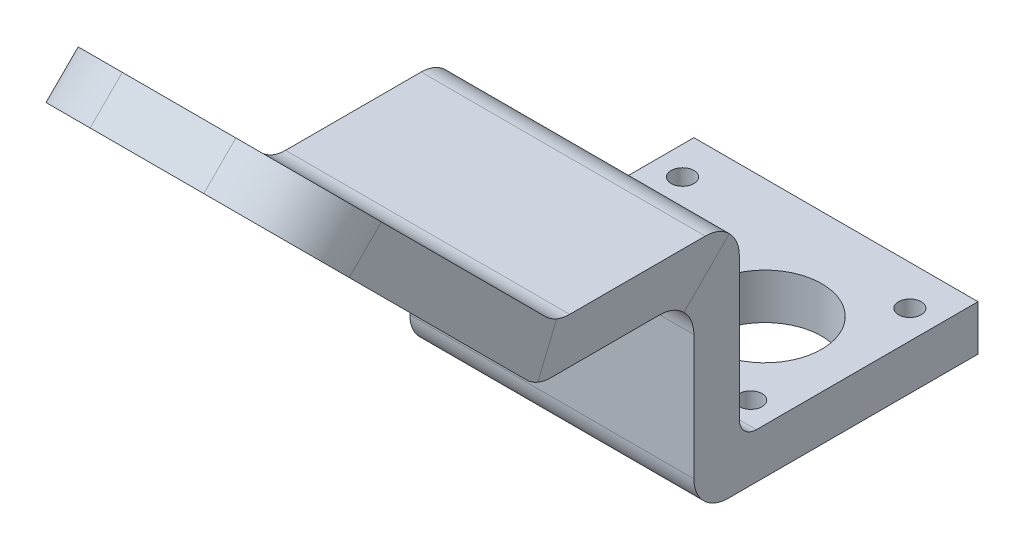
ISO-10303-21;
HEADER;
FILE_DESCRIPTION(('STEP AP214'),'2;1');
FILE_NAME('part.step','',(''),(''),'','','');
FILE_SCHEMA(('AUTOMOTIVE_DESIGN { 1 0 10303 214 1 1 1 1 }'));
ENDSEC;
DATA;
#1=APPLICATION_CONTEXT('core data for automotive mechanical design processes');
#2=APPLICATION_PROTOCOL_DEFINITION('international standard','automotive_design',2000,#1);
#3=PRODUCT_CONTEXT('',#1,'mechanical');
#4=PRODUCT('Part','Part','',(#3));
#5=PRODUCT_RELATED_PRODUCT_CATEGORY('part','',(#4));
#6=PRODUCT_DEFINITION_FORMATION('','',#4);
#7=PRODUCT_DEFINITION_CONTEXT('part definition',#1,'design');
#8=PRODUCT_DEFINITION('design','',#6,#7);
#9=PRODUCT_DEFINITION_SHAPE('','',#8);
#10=(LENGTH_UNIT() NAMED_UNIT(*) SI_UNIT(.MILLI.,.METRE.));
#11=(NAMED_UNIT(*) PLANE_ANGLE_UNIT() SI_UNIT($,.RADIAN.));
#12=(NAMED_UNIT(*) SI_UNIT($,.STERADIAN.) SOLID_ANGLE_UNIT());
#13=UNCERTAINTY_MEASURE_WITH_UNIT(LENGTH_MEASURE(1.E-05),#10,'distance_accuracy_value','');
#14=(GEOMETRIC_REPRESENTATION_CONTEXT(3) GLOBAL_UNCERTAINTY_ASSIGNED_CONTEXT((#13)) GLOBAL_UNIT_ASSIGNED_CONTEXT((#10,
#11,#12)) REPRESENTATION_CONTEXT('',''));
#15=CARTESIAN_POINT('',(0.,0.,0.));
#16=DIRECTION('',(0.,0.,1.));
#17=DIRECTION('',(1.,0.,0.));
#18=AXIS2_PLACEMENT_3D('',#15,#16,#17);
#19=CARTESIAN_POINT('',(25.,8.,-21.));
#20=DIRECTION('',(-1.,0.,0.));
#21=DIRECTION('',(0.,0.,1.));
#22=AXIS2_PLACEMENT_3D('',#19,#20,#21);
#23=PLANE('',#22);
#24=DIRECTION('',(0.,-1.,0.));
#25=VECTOR('',#24,1.);
#26=CARTESIAN_POINT('',(25.,33.,29.));
#27=LINE('',#26,#25);
#28=CARTESIAN_POINT('',(25.,28.,29.));
#29=VERTEX_POINT('',#28);
#30=CARTESIAN_POINT('',(25.,6.,29.));
#31=VERTEX_POINT('',#30);
#32=EDGE_CURVE('E349',#29,#31,#27,.T.);
#33=ORIENTED_EDGE('',*,*,#32,.T.);
#34=CARTESIAN_POINT('',(25.,6.,23.));
#35=DIRECTION('',(-1.,0.,0.));
#36=DIRECTION('',(0.,0.,1.));
#37=AXIS2_PLACEMENT_3D('',#34,#35,#36);
#38=CIRCLE('',#37,6.);
#39=CARTESIAN_POINT('',(25.,0.,23.));
#40=VERTEX_POINT('',#39);
#41=EDGE_CURVE('E244',#31,#40,#38,.F.);
#42=ORIENTED_EDGE('',*,*,#41,.T.);
#43=DIRECTION('',(0.,0.,-1.));
#44=VECTOR('',#43,1.);
#45=CARTESIAN_POINT('',(25.,0.,-21.));
#46=LINE('',#45,#44);
#47=CARTESIAN_POINT('',(25.,0.,-21.));
#48=VERTEX_POINT('',#47);
#49=EDGE_CURVE('E208',#40,#48,#46,.T.);
#50=ORIENTED_EDGE('',*,*,#49,.T.);
#51=DIRECTION('',(0.,-1.,0.));
#52=VECTOR('',#51,1.);
#53=CARTESIAN_POINT('',(25.,8.,-21.));
#54=LINE('',#53,#52);
#55=CARTESIAN_POINT('',(25.,8.,-21.));
#56=VERTEX_POINT('',#55);
#57=EDGE_CURVE('E200',#56,#48,#54,.T.);
#58=ORIENTED_EDGE('',*,*,#57,.F.);
#59=DIRECTION('',(0.,0.,-1.));
#60=VECTOR('',#59,1.);
#61=CARTESIAN_POINT('',(25.,8.,-21.));
#62=LINE('',#61,#60);
#63=CARTESIAN_POINT('',(25.,8.,18.));
#64=VERTEX_POINT('',#63);
#65=EDGE_CURVE('E185',#64,#56,#62,.T.);
#66=ORIENTED_EDGE('',*,*,#65,.F.);
#67=CARTESIAN_POINT('',(25.,11.,18.));
#68=DIRECTION('',(-1.,0.,0.));
#69=DIRECTION('',(0.,0.,1.));
#70=AXIS2_PLACEMENT_3D('',#67,#68,#69);
#71=CIRCLE('',#70,3.);
#72=CARTESIAN_POINT('',(25.,11.,21.));
#73=VERTEX_POINT('',#72);
#74=EDGE_CURVE('E298',#64,#73,#71,.T.);
#75=ORIENTED_EDGE('',*,*,#74,.T.);
#76=DIRECTION('',(0.,-1.,0.));
#77=VECTOR('',#76,1.);
#78=CARTESIAN_POINT('',(25.,33.,21.));
#79=LINE('',#78,#77);
#80=CARTESIAN_POINT('',(25.,36.,21.));
#81=VERTEX_POINT('',#80);
#82=EDGE_CURVE('E351',#81,#73,#79,.T.);
#83=ORIENTED_EDGE('',*,*,#82,.F.);
#84=CARTESIAN_POINT('',(25.,36.,27.));
#85=DIRECTION('',(-1.,0.,0.));
#86=DIRECTION('',(0.,0.,1.));
#87=AXIS2_PLACEMENT_3D('',#84,#85,#86);
#88=CIRCLE('',#87,6.);
#89=CARTESIAN_POINT('',(25.,40.2426406871193,22.7573593128807));
#90=VERTEX_POINT('',#89);
#91=EDGE_CURVE('E242',#81,#90,#88,.F.);
#92=ORIENTED_EDGE('',*,*,#91,.T.);
#93=DIRECTION('',(0.,-0.707106781186547,0.707106781186548));
#94=VECTOR('',#93,1.);
#95=CARTESIAN_POINT('',(25.,33.5,29.5));
#96=LINE('',#95,#94);
#97=CARTESIAN_POINT('',(25.,32.2426406871193,30.7573593128807));
#98=VERTEX_POINT('',#97);
#99=EDGE_CURVE('E392',#90,#98,#96,.T.);
#100=ORIENTED_EDGE('',*,*,#99,.T.);
#101=CARTESIAN_POINT('',(25.,28.,35.));
#102=DIRECTION('',(-1.,0.,0.));
#103=DIRECTION('',(0.,0.,1.));
#104=AXIS2_PLACEMENT_3D('',#101,#102,#103);
#105=CIRCLE('',#104,6.);
#106=EDGE_CURVE('E293',#98,#29,#105,.T.);
#107=ORIENTED_EDGE('',*,*,#106,.T.);
#108=EDGE_LOOP('',(#33,#42,#50,#58,#66,#75,#83,#92,#100,#107));
#109=FACE_BOUND('',#108,.T.);
#110=ADVANCED_FACE('F34',(#109),#23,.F.);
#111=CARTESIAN_POINT('',(-25.,8.,-21.));
#112=DIRECTION('',(0.,0.,1.));
#113=DIRECTION('',(1.,0.,0.));
#114=AXIS2_PLACEMENT_3D('',#111,#112,#113);
#115=PLANE('',#114);
#116=DIRECTION('',(-1.,0.,0.));
#117=VECTOR('',#116,1.);
#118=CARTESIAN_POINT('',(-25.,0.,-21.));
#119=LINE('',#118,#117);
#120=CARTESIAN_POINT('',(-25.,0.,-21.));
#121=VERTEX_POINT('',#120);
#122=EDGE_CURVE('E373',#48,#121,#119,.T.);
#123=ORIENTED_EDGE('',*,*,#122,.T.);
#124=DIRECTION('',(0.,-1.,0.));
#125=VECTOR('',#124,1.);
#126=CARTESIAN_POINT('',(-25.,8.,-21.));
#127=LINE('',#126,#125);
#128=CARTESIAN_POINT('',(-25.,8.,-21.));
#129=VERTEX_POINT('',#128);
#130=EDGE_CURVE('E202',#129,#121,#127,.T.);
#131=ORIENTED_EDGE('',*,*,#130,.F.);
#132=DIRECTION('',(-1.,0.,0.));
#133=VECTOR('',#132,1.);
#134=CARTESIAN_POINT('',(-25.,8.,-21.));
#135=LINE('',#134,#133);
#136=EDGE_CURVE('E189',#56,#129,#135,.T.);
#137=ORIENTED_EDGE('',*,*,#136,.F.);
#138=ORIENTED_EDGE('',*,*,#57,.T.);
#139=EDGE_LOOP('',(#123,#131,#137,#138));
#140=FACE_BOUND('',#139,.T.);
#141=ADVANCED_FACE('F199',(#140),#115,.F.);
#142=CARTESIAN_POINT('',(-25.,8.,-21.));
#143=DIRECTION('',(1.,0.,0.));
#144=DIRECTION('',(0.,0.,-1.));
#145=AXIS2_PLACEMENT_3D('',#142,#143,#144);
#146=PLANE('',#145);
#147=DIRECTION('',(0.,0.,1.));
#148=VECTOR('',#147,1.);
#149=CARTESIAN_POINT('',(-25.,0.,-21.));
#150=LINE('',#149,#148);
#151=CARTESIAN_POINT('',(-25.,0.,23.));
#152=VERTEX_POINT('',#151);
#153=EDGE_CURVE('E195',#121,#152,#150,.T.);
#154=ORIENTED_EDGE('',*,*,#153,.T.);
#155=CARTESIAN_POINT('',(-25.,6.,23.));
#156=DIRECTION('',(1.,0.,0.));
#157=DIRECTION('',(0.,0.,-1.));
#158=AXIS2_PLACEMENT_3D('',#155,#156,#157);
#159=CIRCLE('',#158,6.);
#160=CARTESIAN_POINT('',(-25.,6.,29.));
#161=VERTEX_POINT('',#160);
#162=EDGE_CURVE('E235',#152,#161,#159,.F.);
#163=ORIENTED_EDGE('',*,*,#162,.T.);
#164=DIRECTION('',(0.,-1.,0.));
#165=VECTOR('',#164,1.);
#166=CARTESIAN_POINT('',(-25.,33.,29.));
#167=LINE('',#166,#165);
#168=CARTESIAN_POINT('',(-25.,28.,29.));
#169=VERTEX_POINT('',#168);
#170=EDGE_CURVE('E345',#169,#161,#167,.T.);
#171=ORIENTED_EDGE('',*,*,#170,.F.);
#172=CARTESIAN_POINT('',(-25.,28.,35.));
#173=DIRECTION('',(1.,0.,0.));
#174=DIRECTION('',(0.,0.,-1.));
#175=AXIS2_PLACEMENT_3D('',#172,#173,#174);
#176=CIRCLE('',#175,6.);
#177=CARTESIAN_POINT('',(-25.,32.2426406871193,30.7573593128807));
#178=VERTEX_POINT('',#177);
#179=EDGE_CURVE('E285',#169,#178,#176,.T.);
#180=ORIENTED_EDGE('',*,*,#179,.T.);
#181=DIRECTION('',(0.,0.707106781186547,-0.707106781186548));
#182=VECTOR('',#181,1.);
#183=CARTESIAN_POINT('',(-25.,37.5,25.5));
#184=LINE('',#183,#182);
#185=CARTESIAN_POINT('',(-25.,40.2426406871193,22.7573593128807));
#186=VERTEX_POINT('',#185);
#187=EDGE_CURVE('E357',#178,#186,#184,.T.);
#188=ORIENTED_EDGE('',*,*,#187,.T.);
#189=CARTESIAN_POINT('',(-25.,36.,27.));
#190=DIRECTION('',(1.,0.,0.));
#191=DIRECTION('',(0.,0.,-1.));
#192=AXIS2_PLACEMENT_3D('',#189,#190,#191);
#193=CIRCLE('',#192,6.);
#194=CARTESIAN_POINT('',(-25.,36.,21.));
#195=VERTEX_POINT('',#194);
#196=EDGE_CURVE('E213',#186,#195,#193,.F.);
#197=ORIENTED_EDGE('',*,*,#196,.T.);
#198=DIRECTION('',(0.,-1.,0.));
#199=VECTOR('',#198,1.);
#200=CARTESIAN_POINT('',(-25.,33.,21.));
#201=LINE('',#200,#199);
#202=CARTESIAN_POINT('',(-25.,11.,21.));
#203=VERTEX_POINT('',#202);
#204=EDGE_CURVE('E354',#195,#203,#201,.T.);
#205=ORIENTED_EDGE('',*,*,#204,.T.);
#206=CARTESIAN_POINT('',(-25.,11.,18.));
#207=DIRECTION('',(1.,0.,0.));
#208=DIRECTION('',(0.,0.,-1.));
#209=AXIS2_PLACEMENT_3D('',#206,#207,#208);
#210=CIRCLE('',#209,3.);
#211=CARTESIAN_POINT('',(-25.,8.,18.));
#212=VERTEX_POINT('',#211);
#213=EDGE_CURVE('E300',#203,#212,#210,.T.);
#214=ORIENTED_EDGE('',*,*,#213,.T.);
#215=DIRECTION('',(0.,0.,1.));
#216=VECTOR('',#215,1.);
#217=CARTESIAN_POINT('',(-25.,8.,-21.));
#218=LINE('',#217,#216);
#219=EDGE_CURVE('E204',#129,#212,#218,.T.);
#220=ORIENTED_EDGE('',*,*,#219,.F.);
#221=ORIENTED_EDGE('',*,*,#130,.T.);
#222=EDGE_LOOP('',(#154,#163,#171,#180,#188,#197,#205,#214,#220,#221));
#223=FACE_BOUND('',#222,.T.);
#224=ADVANCED_FACE('F377',(#223),#146,.F.);
#225=CARTESIAN_POINT('',(0.,8.,0.));
#226=DIRECTION('',(0.,1.,0.));
#227=DIRECTION('',(0.,0.,1.));
#228=AXIS2_PLACEMENT_3D('',#225,#226,#227);
#229=PLANE('',#228);
#230=CARTESIAN_POINT('',(20.,8.,-14.));
#231=DIRECTION('',(0.,1.,0.));
#232=DIRECTION('',(0.,0.,1.));
#233=AXIS2_PLACEMENT_3D('',#230,#231,#232);
#234=CIRCLE('',#233,2.);
#235=CARTESIAN_POINT('',(20.,8.,-12.));
#236=VERTEX_POINT('',#235);
#237=EDGE_CURVE('E364',#236,#236,#234,.T.);
#238=ORIENTED_EDGE('',*,*,#237,.F.);
#239=EDGE_LOOP('',(#238));
#240=FACE_BOUND('',#239,.T.);
#241=CARTESIAN_POINT('',(20.,8.,14.));
#242=DIRECTION('',(0.,1.,0.));
#243=DIRECTION('',(0.,0.,1.));
#244=AXIS2_PLACEMENT_3D('',#241,#242,#243);
#245=CIRCLE('',#244,2.);
#246=CARTESIAN_POINT('',(20.,8.,16.));
#247=VERTEX_POINT('',#246);
#248=EDGE_CURVE('E361',#247,#247,#245,.T.);
#249=ORIENTED_EDGE('',*,*,#248,.F.);
#250=EDGE_LOOP('',(#249));
#251=FACE_BOUND('',#250,.T.);
#252=CARTESIAN_POINT('',(-20.,8.,14.));
#253=DIRECTION('',(0.,1.,0.));
#254=DIRECTION('',(0.,0.,1.));
#255=AXIS2_PLACEMENT_3D('',#252,#253,#254);
#256=CIRCLE('',#255,2.);
#257=CARTESIAN_POINT('',(-20.,8.,16.));
#258=VERTEX_POINT('',#257);
#259=EDGE_CURVE('E358',#258,#258,#256,.T.);
#260=ORIENTED_EDGE('',*,*,#259,.F.);
#261=EDGE_LOOP('',(#260));
#262=FACE_BOUND('',#261,.T.);
#263=CARTESIAN_POINT('',(8.50000000000001,8.,0.));
#264=DIRECTION('',(0.,1.,0.));
#265=DIRECTION('',(0.,0.,1.));
#266=AXIS2_PLACEMENT_3D('',#263,#264,#265);
#267=CIRCLE('',#266,10.);
#268=CARTESIAN_POINT('',(8.50000000000001,8.,10.));
#269=VERTEX_POINT('',#268);
#270=EDGE_CURVE('E348',#269,#269,#267,.T.);
#271=ORIENTED_EDGE('',*,*,#270,.F.);
#272=EDGE_LOOP('',(#271));
#273=FACE_BOUND('',#272,.T.);
#274=CARTESIAN_POINT('',(-20.,8.,-14.));
#275=DIRECTION('',(0.,1.,0.));
#276=DIRECTION('',(0.,0.,1.));
#277=AXIS2_PLACEMENT_3D('',#274,#275,#276);
#278=CIRCLE('',#277,2.);
#279=CARTESIAN_POINT('',(-20.,8.,-12.));
#280=VERTEX_POINT('',#279);
#281=EDGE_CURVE('E222',#280,#280,#278,.T.);
#282=ORIENTED_EDGE('',*,*,#281,.F.);
#283=EDGE_LOOP('',(#282));
#284=FACE_BOUND('',#283,.T.);
#285=ORIENTED_EDGE('',*,*,#219,.T.);
#286=DIRECTION('',(1.,0.,0.));
#287=VECTOR('',#286,1.);
#288=CARTESIAN_POINT('',(25.,8.,18.));
#289=LINE('',#288,#287);
#290=EDGE_CURVE('E192',#212,#64,#289,.T.);
#291=ORIENTED_EDGE('',*,*,#290,.T.);
#292=ORIENTED_EDGE('',*,*,#65,.T.);
#293=ORIENTED_EDGE('',*,*,#136,.T.);
#294=EDGE_LOOP('',(#285,#291,#292,#293));
#295=FACE_BOUND('',#294,.T.);
#296=ADVANCED_FACE('F188',(#240,#251,#262,#273,#284,#295),#229,.T.);
#297=CARTESIAN_POINT('',(0.,0.,0.));
#298=DIRECTION('',(0.,1.,0.));
#299=DIRECTION('',(0.,0.,1.));
#300=AXIS2_PLACEMENT_3D('',#297,#298,#299);
#301=PLANE('',#300);
#302=CARTESIAN_POINT('',(20.,0.,-14.));
#303=DIRECTION('',(0.,1.,0.));
#304=DIRECTION('',(0.,0.,1.));
#305=AXIS2_PLACEMENT_3D('',#302,#303,#304);
#306=CIRCLE('',#305,2.);
#307=CARTESIAN_POINT('',(20.,0.,-12.));
#308=VERTEX_POINT('',#307);
#309=EDGE_CURVE('E231',#308,#308,#306,.T.);
#310=ORIENTED_EDGE('',*,*,#309,.T.);
#311=EDGE_LOOP('',(#310));
#312=FACE_BOUND('',#311,.T.);
#313=CARTESIAN_POINT('',(20.,0.,14.));
#314=DIRECTION('',(0.,1.,0.));
#315=DIRECTION('',(0.,0.,1.));
#316=AXIS2_PLACEMENT_3D('',#313,#314,#315);
#317=CIRCLE('',#316,2.);
#318=CARTESIAN_POINT('',(20.,0.,16.));
#319=VERTEX_POINT('',#318);
#320=EDGE_CURVE('E228',#319,#319,#317,.T.);
#321=ORIENTED_EDGE('',*,*,#320,.T.);
#322=EDGE_LOOP('',(#321));
#323=FACE_BOUND('',#322,.T.);
#324=CARTESIAN_POINT('',(-20.,0.,14.));
#325=DIRECTION('',(0.,1.,0.));
#326=DIRECTION('',(0.,0.,1.));
#327=AXIS2_PLACEMENT_3D('',#324,#325,#326);
#328=CIRCLE('',#327,2.);
#329=CARTESIAN_POINT('',(-20.,0.,16.));
#330=VERTEX_POINT('',#329);
#331=EDGE_CURVE('E225',#330,#330,#328,.T.);
#332=ORIENTED_EDGE('',*,*,#331,.T.);
#333=EDGE_LOOP('',(#332));
#334=FACE_BOUND('',#333,.T.);
#335=CARTESIAN_POINT('',(8.50000000000001,0.,0.));
#336=DIRECTION('',(0.,1.,0.));
#337=DIRECTION('',(0.,0.,1.));
#338=AXIS2_PLACEMENT_3D('',#335,#336,#337);
#339=CIRCLE('',#338,10.);
#340=CARTESIAN_POINT('',(8.50000000000001,0.,10.));
#341=VERTEX_POINT('',#340);
#342=EDGE_CURVE('E221',#341,#341,#339,.T.);
#343=ORIENTED_EDGE('',*,*,#342,.T.);
#344=EDGE_LOOP('',(#343));
#345=FACE_BOUND('',#344,.T.);
#346=CARTESIAN_POINT('',(-20.,0.,-14.));
#347=DIRECTION('',(0.,1.,0.));
#348=DIRECTION('',(0.,0.,1.));
#349=AXIS2_PLACEMENT_3D('',#346,#347,#348);
#350=CIRCLE('',#349,2.);
#351=CARTESIAN_POINT('',(-20.,0.,-12.));
#352=VERTEX_POINT('',#351);
#353=EDGE_CURVE('E218',#352,#352,#350,.T.);
#354=ORIENTED_EDGE('',*,*,#353,.T.);
#355=EDGE_LOOP('',(#354));
#356=FACE_BOUND('',#355,.T.);
#357=ORIENTED_EDGE('',*,*,#49,.F.);
#358=DIRECTION('',(-1.,0.,0.));
#359=VECTOR('',#358,1.);
#360=CARTESIAN_POINT('',(-25.,0.,23.));
#361=LINE('',#360,#359);
#362=EDGE_CURVE('E210',#40,#152,#361,.T.);
#363=ORIENTED_EDGE('',*,*,#362,.T.);
#364=ORIENTED_EDGE('',*,*,#153,.F.);
#365=ORIENTED_EDGE('',*,*,#122,.F.);
#366=EDGE_LOOP('',(#357,#363,#364,#365));
#367=FACE_BOUND('',#366,.T.);
#368=ADVANCED_FACE('F380',(#312,#323,#334,#345,#356,#367),#301,.F.);
#369=CARTESIAN_POINT('',(-20.,-4.,-14.));
#370=DIRECTION('',(0.,1.,0.));
#371=DIRECTION('',(0.,0.,1.));
#372=AXIS2_PLACEMENT_3D('',#369,#370,#371);
#373=CYLINDRICAL_SURFACE('',#372,2.);
#374=ORIENTED_EDGE('',*,*,#281,.T.);
#375=EDGE_LOOP('',(#374));
#376=FACE_BOUND('',#375,.T.);
#377=ORIENTED_EDGE('',*,*,#353,.F.);
#378=EDGE_LOOP('',(#377));
#379=FACE_BOUND('',#378,.T.);
#380=ADVANCED_FACE('F686',(#376,#379),#373,.F.);
#381=CARTESIAN_POINT('',(8.50000000000001,-4.,0.));
#382=DIRECTION('',(0.,1.,0.));
#383=DIRECTION('',(0.,0.,1.));
#384=AXIS2_PLACEMENT_3D('',#381,#382,#383);
#385=CYLINDRICAL_SURFACE('',#384,10.);
#386=ORIENTED_EDGE('',*,*,#270,.T.);
#387=EDGE_LOOP('',(#386));
#388=FACE_BOUND('',#387,.T.);
#389=ORIENTED_EDGE('',*,*,#342,.F.);
#390=EDGE_LOOP('',(#389));
#391=FACE_BOUND('',#390,.T.);
#392=ADVANCED_FACE('F682',(#388,#391),#385,.F.);
#393=CARTESIAN_POINT('',(-20.,-4.,14.));
#394=DIRECTION('',(0.,1.,0.));
#395=DIRECTION('',(0.,0.,1.));
#396=AXIS2_PLACEMENT_3D('',#393,#394,#395);
#397=CYLINDRICAL_SURFACE('',#396,2.);
#398=ORIENTED_EDGE('',*,*,#259,.T.);
#399=EDGE_LOOP('',(#398));
#400=FACE_BOUND('',#399,.T.);
#401=ORIENTED_EDGE('',*,*,#331,.F.);
#402=EDGE_LOOP('',(#401));
#403=FACE_BOUND('',#402,.T.);
#404=ADVANCED_FACE('F678',(#400,#403),#397,.F.);
#405=CARTESIAN_POINT('',(20.,-4.,14.));
#406=DIRECTION('',(0.,1.,0.));
#407=DIRECTION('',(0.,0.,1.));
#408=AXIS2_PLACEMENT_3D('',#405,#406,#407);
#409=CYLINDRICAL_SURFACE('',#408,2.);
#410=ORIENTED_EDGE('',*,*,#248,.T.);
#411=EDGE_LOOP('',(#410));
#412=FACE_BOUND('',#411,.T.);
#413=ORIENTED_EDGE('',*,*,#320,.F.);
#414=EDGE_LOOP('',(#413));
#415=FACE_BOUND('',#414,.T.);
#416=ADVANCED_FACE('F681',(#412,#415),#409,.F.);
#417=CARTESIAN_POINT('',(20.,-4.,-14.));
#418=DIRECTION('',(0.,1.,0.));
#419=DIRECTION('',(0.,0.,1.));
#420=AXIS2_PLACEMENT_3D('',#417,#418,#419);
#421=CYLINDRICAL_SURFACE('',#420,2.);
#422=ORIENTED_EDGE('',*,*,#237,.T.);
#423=EDGE_LOOP('',(#422));
#424=FACE_BOUND('',#423,.T.);
#425=ORIENTED_EDGE('',*,*,#309,.F.);
#426=EDGE_LOOP('',(#425));
#427=FACE_BOUND('',#426,.T.);
#428=ADVANCED_FACE('F537',(#424,#427),#421,.F.);
#429=CARTESIAN_POINT('',(-25.,33.,21.));
#430=DIRECTION('',(0.,0.,-1.));
#431=DIRECTION('',(-1.,0.,0.));
#432=AXIS2_PLACEMENT_3D('',#429,#430,#431);
#433=PLANE('',#432);
#434=ORIENTED_EDGE('',*,*,#82,.T.);
#435=DIRECTION('',(1.,0.,0.));
#436=VECTOR('',#435,1.);
#437=CARTESIAN_POINT('',(-25.,11.,21.));
#438=LINE('',#437,#436);
#439=EDGE_CURVE('E296',#73,#203,#438,.F.);
#440=ORIENTED_EDGE('',*,*,#439,.T.);
#441=ORIENTED_EDGE('',*,*,#204,.F.);
#442=DIRECTION('',(1.,0.,0.));
#443=VECTOR('',#442,1.);
#444=CARTESIAN_POINT('',(-25.,36.,21.));
#445=LINE('',#444,#443);
#446=EDGE_CURVE('E272',#195,#81,#445,.T.);
#447=ORIENTED_EDGE('',*,*,#446,.T.);
#448=EDGE_LOOP('',(#434,#440,#441,#447));
#449=FACE_BOUND('',#448,.T.);
#450=ADVANCED_FACE('F463',(#449),#433,.T.);
#451=CARTESIAN_POINT('',(-25.,33.,29.));
#452=DIRECTION('',(0.,0.,1.));
#453=DIRECTION('',(1.,0.,0.));
#454=AXIS2_PLACEMENT_3D('',#451,#452,#453);
#455=PLANE('',#454);
#456=ORIENTED_EDGE('',*,*,#170,.T.);
#457=DIRECTION('',(-1.,0.,0.));
#458=VECTOR('',#457,1.);
#459=CARTESIAN_POINT('',(25.,6.,29.));
#460=LINE('',#459,#458);
#461=EDGE_CURVE('E240',#161,#31,#460,.F.);
#462=ORIENTED_EDGE('',*,*,#461,.T.);
#463=ORIENTED_EDGE('',*,*,#32,.F.);
#464=DIRECTION('',(-1.,0.,0.));
#465=VECTOR('',#464,1.);
#466=CARTESIAN_POINT('',(-25.,28.,29.));
#467=LINE('',#466,#465);
#468=EDGE_CURVE('E237',#29,#169,#467,.T.);
#469=ORIENTED_EDGE('',*,*,#468,.T.);
#470=EDGE_LOOP('',(#456,#462,#463,#469));
#471=FACE_BOUND('',#470,.T.);
#472=ADVANCED_FACE('F388',(#471),#455,.T.);
#473=CARTESIAN_POINT('',(0.,98.1040764008565,79.748737341529));
#474=DIRECTION('',(0.,0.707106781186549,0.707106781186546));
#475=DIRECTION('',(0.,-0.707106781186546,0.707106781186549));
#476=AXIS2_PLACEMENT_3D('',#473,#474,#475);
#477=PLANE('',#476);
#478=DIRECTION('',(-1.,0.,0.));
#479=VECTOR('',#478,1.);
#480=CARTESIAN_POINT('',(25.,83.2548339959391,94.5979797464466));
#481=LINE('',#480,#479);
#482=CARTESIAN_POINT('',(10.,83.2548339959391,94.5979797464466));
#483=VERTEX_POINT('',#482);
#484=CARTESIAN_POINT('',(-9.99999999999999,83.2548339959391,94.5979797464466));
#485=VERTEX_POINT('',#484);
#486=EDGE_CURVE('E316',#483,#485,#481,.T.);
#487=ORIENTED_EDGE('',*,*,#486,.T.);
#488=DIRECTION('',(0.,-0.707106781186546,0.707106781186549));
#489=VECTOR('',#488,1.);
#490=CARTESIAN_POINT('',(-9.99999999999999,98.1040764008565,79.748737341529));
#491=LINE('',#490,#489);
#492=CARTESIAN_POINT('',(-9.99999999999999,77.5979797464467,100.254833995939));
#493=VERTEX_POINT('',#492);
#494=EDGE_CURVE('E305',#485,#493,#491,.T.);
#495=ORIENTED_EDGE('',*,*,#494,.T.);
#496=DIRECTION('',(1.,0.,0.));
#497=VECTOR('',#496,1.);
#498=CARTESIAN_POINT('',(-25.,77.5979797464467,100.254833995939));
#499=LINE('',#498,#497);
#500=CARTESIAN_POINT('',(10.,77.5979797464467,100.254833995939));
#501=VERTEX_POINT('',#500);
#502=EDGE_CURVE('E326',#493,#501,#499,.T.);
#503=ORIENTED_EDGE('',*,*,#502,.T.);
#504=DIRECTION('',(0.,0.707106781186546,-0.707106781186549));
#505=VECTOR('',#504,1.);
#506=CARTESIAN_POINT('',(10.,98.1040764008565,79.748737341529));
#507=LINE('',#506,#505);
#508=EDGE_CURVE('E302',#501,#483,#507,.T.);
#509=ORIENTED_EDGE('',*,*,#508,.T.);
#510=EDGE_LOOP('',(#487,#495,#503,#509));
#511=FACE_BOUND('',#510,.T.);
#512=ADVANCED_FACE('F321',(#511),#477,.T.);
#513=CARTESIAN_POINT('',(25.,39.4689862838483,50.812132034356));
#514=DIRECTION('',(0.,0.707106781186546,-0.707106781186549));
#515=DIRECTION('',(0.,0.707106781186549,0.707106781186546));
#516=AXIS2_PLACEMENT_3D('',#513,#514,#515);
#517=PLANE('',#516);
#518=CARTESIAN_POINT('',(0.,74.7695526217005,86.112698372208));
#519=DIRECTION('',(0.,0.707106781186546,-0.707106781186549));
#520=DIRECTION('',(0.,0.707106781186549,0.707106781186546));
#521=AXIS2_PLACEMENT_3D('',#518,#519,#520);
#522=CIRCLE('',#521,3.);
#523=CARTESIAN_POINT('',(0.,76.8908729652601,88.2340187157676));
#524=VERTEX_POINT('',#523);
#525=EDGE_CURVE('E421',#524,#524,#522,.T.);
#526=ORIENTED_EDGE('',*,*,#525,.F.);
#527=EDGE_LOOP('',(#526));
#528=FACE_BOUND('',#527,.T.);
#529=CARTESIAN_POINT('',(0.,62.0416305603426,73.3847763108502));
#530=DIRECTION('',(0.,0.707106781186546,-0.707106781186549));
#531=DIRECTION('',(0.,0.707106781186549,0.707106781186546));
#532=AXIS2_PLACEMENT_3D('',#529,#530,#531);
#533=CIRCLE('',#532,3.);
#534=CARTESIAN_POINT('',(0.,64.1629509039023,75.5060966544098));
#535=VERTEX_POINT('',#534);
#536=EDGE_CURVE('E423',#535,#535,#533,.T.);
#537=ORIENTED_EDGE('',*,*,#536,.F.);
#538=EDGE_LOOP('',(#537));
#539=FACE_BOUND('',#538,.T.);
#540=DIRECTION('',(0.,0.707106781186549,0.707106781186546));
#541=VECTOR('',#540,1.);
#542=CARTESIAN_POINT('',(-25.,39.4689862838483,50.812132034356));
#543=LINE('',#542,#541);
#544=CARTESIAN_POINT('',(-25.,43.7573593128807,55.1005050633883));
#545=VERTEX_POINT('',#544);
#546=CARTESIAN_POINT('',(-25.,72.6482322781409,83.9913780286484));
#547=VERTEX_POINT('',#546);
#548=EDGE_CURVE('E317',#545,#547,#543,.T.);
#549=ORIENTED_EDGE('',*,*,#548,.T.);
#550=CARTESIAN_POINT('',(-9.99999999999999,72.6482322781408,83.9913780286484));
#551=DIRECTION('',(0.,0.707106781186546,-0.707106781186549));
#552=DIRECTION('',(0.,0.707106781186549,0.707106781186546));
#553=AXIS2_PLACEMENT_3D('',#550,#551,#552);
#554=CIRCLE('',#553,15.);
#555=EDGE_CURVE('E42',#547,#485,#554,.T.);
#556=ORIENTED_EDGE('',*,*,#555,.T.);
#557=ORIENTED_EDGE('',*,*,#486,.F.);
#558=CARTESIAN_POINT('',(10.,72.6482322781408,83.9913780286484));
#559=DIRECTION('',(0.,0.707106781186546,-0.707106781186549));
#560=DIRECTION('',(0.,0.707106781186549,0.707106781186546));
#561=AXIS2_PLACEMENT_3D('',#558,#559,#560);
#562=CIRCLE('',#561,15.);
#563=CARTESIAN_POINT('',(25.,72.6482322781409,83.9913780286484));
#564=VERTEX_POINT('',#563);
#565=EDGE_CURVE('E49',#483,#564,#562,.T.);
#566=ORIENTED_EDGE('',*,*,#565,.T.);
#567=DIRECTION('',(0.,0.707106781186549,0.707106781186546));
#568=VECTOR('',#567,1.);
#569=CARTESIAN_POINT('',(25.,39.4689862838483,50.812132034356));
#570=LINE('',#569,#568);
#571=CARTESIAN_POINT('',(25.,43.7573593128807,55.1005050633883));
#572=VERTEX_POINT('',#571);
#573=EDGE_CURVE('E338',#572,#564,#570,.T.);
#574=ORIENTED_EDGE('',*,*,#573,.F.);
#575=DIRECTION('',(1.,0.,0.));
#576=VECTOR('',#575,1.);
#577=CARTESIAN_POINT('',(-25.,43.7573593128807,55.1005050633883));
#578=LINE('',#577,#576);
#579=EDGE_CURVE('E270',#572,#545,#578,.F.);
#580=ORIENTED_EDGE('',*,*,#579,.T.);
#581=EDGE_LOOP('',(#549,#556,#557,#566,#574,#580));
#582=FACE_BOUND('',#581,.T.);
#583=ADVANCED_FACE('F315',(#528,#539,#582),#517,.T.);
#584=CARTESIAN_POINT('',(-25.,39.4689862838483,50.812132034356));
#585=DIRECTION('',(-1.,0.,0.));
#586=DIRECTION('',(0.,-1.,0.));
#587=AXIS2_PLACEMENT_3D('',#584,#585,#586);
#588=PLANE('',#587);
#589=DIRECTION('',(0.,0.707106781186549,0.707106781186546));
#590=VECTOR('',#589,1.);
#591=CARTESIAN_POINT('',(-25.,33.812132034356,56.4689862838484));
#592=LINE('',#591,#590);
#593=CARTESIAN_POINT('',(-25.,35.7573593128807,58.4142135623731));
#594=VERTEX_POINT('',#593);
#595=CARTESIAN_POINT('',(-25.,66.9913780286485,89.6482322781408));
#596=VERTEX_POINT('',#595);
#597=EDGE_CURVE('E332',#594,#596,#592,.T.);
#598=ORIENTED_EDGE('',*,*,#597,.T.);
#599=DIRECTION('',(0.,-0.707106781186546,0.707106781186549));
#600=VECTOR('',#599,1.);
#601=CARTESIAN_POINT('',(-25.,72.6482322781409,83.9913780286484));
#602=LINE('',#601,#600);
#603=EDGE_CURVE('E57',#596,#547,#602,.F.);
#604=ORIENTED_EDGE('',*,*,#603,.T.);
#605=ORIENTED_EDGE('',*,*,#548,.F.);
#606=CARTESIAN_POINT('',(-25.,48.,50.857864376269));
#607=DIRECTION('',(-1.,0.,0.));
#608=DIRECTION('',(0.,-1.,0.));
#609=AXIS2_PLACEMENT_3D('',#606,#607,#608);
#610=CIRCLE('',#609,6.);
#611=CARTESIAN_POINT('',(-25.,42.4567228049323,53.1539649704596));
#612=VERTEX_POINT('',#611);
#613=EDGE_CURVE('E280',#545,#612,#610,.F.);
#614=ORIENTED_EDGE('',*,*,#613,.T.);
#615=DIRECTION('',(0.,0.923879532511287,-0.382683432365091));
#616=VECTOR('',#615,1.);
#617=CARTESIAN_POINT('',(-25.,53.6118055378411,48.5333784130948));
#618=LINE('',#617,#616);
#619=CARTESIAN_POINT('',(-25.,34.4567228049323,56.4676734694444));
#620=VERTEX_POINT('',#619);
#621=EDGE_CURVE('E434',#620,#612,#618,.T.);
#622=ORIENTED_EDGE('',*,*,#621,.F.);
#623=CARTESIAN_POINT('',(-25.,40.,54.1715728752538));
#624=DIRECTION('',(-1.,0.,0.));
#625=DIRECTION('',(0.,-1.,0.));
#626=AXIS2_PLACEMENT_3D('',#623,#624,#625);
#627=CIRCLE('',#626,6.);
#628=EDGE_CURVE('E255',#620,#594,#627,.T.);
#629=ORIENTED_EDGE('',*,*,#628,.T.);
#630=EDGE_LOOP('',(#598,#604,#605,#614,#622,#629));
#631=FACE_BOUND('',#630,.T.);
#632=ADVANCED_FACE('F334',(#631),#588,.T.);
#633=CARTESIAN_POINT('',(-25.,33.812132034356,56.4689862838484));
#634=DIRECTION('',(0.,-0.707106781186546,0.707106781186549));
#635=DIRECTION('',(0.,-0.707106781186549,-0.707106781186546));
#636=AXIS2_PLACEMENT_3D('',#633,#634,#635);
#637=PLANE('',#636);
#638=CARTESIAN_POINT('',(0.,69.1126983722081,91.7695526217004));
#639=DIRECTION('',(0.,-0.707106781186546,0.707106781186549));
#640=DIRECTION('',(0.,-0.707106781186549,-0.707106781186546));
#641=AXIS2_PLACEMENT_3D('',#638,#639,#640);
#642=CIRCLE('',#641,3.);
#643=CARTESIAN_POINT('',(0.,66.9913780286485,89.6482322781408));
#644=VERTEX_POINT('',#643);
#645=EDGE_CURVE('E783',#644,#644,#642,.T.);
#646=ORIENTED_EDGE('',*,*,#645,.F.);
#647=EDGE_LOOP('',(#646));
#648=FACE_BOUND('',#647,.T.);
#649=CARTESIAN_POINT('',(0.,56.3847763108503,79.0416305603426));
#650=DIRECTION('',(0.,-0.707106781186546,0.707106781186549));
#651=DIRECTION('',(0.,-0.707106781186549,-0.707106781186546));
#652=AXIS2_PLACEMENT_3D('',#649,#650,#651);
#653=CIRCLE('',#652,3.);
#654=CARTESIAN_POINT('',(0.,54.2634559672906,76.920310216783));
#655=VERTEX_POINT('',#654);
#656=EDGE_CURVE('E428',#655,#655,#653,.T.);
#657=ORIENTED_EDGE('',*,*,#656,.F.);
#658=EDGE_LOOP('',(#657));
#659=FACE_BOUND('',#658,.T.);
#660=ORIENTED_EDGE('',*,*,#502,.F.);
#661=CARTESIAN_POINT('',(-9.99999999999999,66.9913780286485,89.6482322781408));
#662=DIRECTION('',(0.,-0.707106781186546,0.707106781186549));
#663=DIRECTION('',(0.,-0.707106781186549,-0.707106781186546));
#664=AXIS2_PLACEMENT_3D('',#661,#662,#663);
#665=CIRCLE('',#664,15.);
#666=EDGE_CURVE('E310',#493,#596,#665,.T.);
#667=ORIENTED_EDGE('',*,*,#666,.T.);
#668=ORIENTED_EDGE('',*,*,#597,.F.);
#669=DIRECTION('',(-1.,0.,0.));
#670=VECTOR('',#669,1.);
#671=CARTESIAN_POINT('',(-25.,35.7573593128807,58.4142135623731));
#672=LINE('',#671,#670);
#673=CARTESIAN_POINT('',(25.,35.7573593128807,58.4142135623731));
#674=VERTEX_POINT('',#673);
#675=EDGE_CURVE('E257',#594,#674,#672,.F.);
#676=ORIENTED_EDGE('',*,*,#675,.T.);
#677=DIRECTION('',(0.,0.707106781186549,0.707106781186546));
#678=VECTOR('',#677,1.);
#679=CARTESIAN_POINT('',(25.,33.812132034356,56.4689862838484));
#680=LINE('',#679,#678);
#681=CARTESIAN_POINT('',(25.,66.9913780286485,89.6482322781408));
#682=VERTEX_POINT('',#681);
#683=EDGE_CURVE('E325',#674,#682,#680,.T.);
#684=ORIENTED_EDGE('',*,*,#683,.T.);
#685=CARTESIAN_POINT('',(10.,66.9913780286485,89.6482322781408));
#686=DIRECTION('',(0.,-0.707106781186546,0.707106781186549));
#687=DIRECTION('',(0.,-0.707106781186549,-0.707106781186546));
#688=AXIS2_PLACEMENT_3D('',#685,#686,#687);
#689=CIRCLE('',#688,15.);
#690=EDGE_CURVE('E308',#682,#501,#689,.T.);
#691=ORIENTED_EDGE('',*,*,#690,.T.);
#692=EDGE_LOOP('',(#660,#667,#668,#676,#684,#691));
#693=FACE_BOUND('',#692,.T.);
#694=ADVANCED_FACE('F331',(#648,#659,#693),#637,.T.);
#695=CARTESIAN_POINT('',(25.,33.812132034356,56.4689862838484));
#696=DIRECTION('',(1.,0.,0.));
#697=DIRECTION('',(0.,1.,0.));
#698=AXIS2_PLACEMENT_3D('',#695,#696,#697);
#699=PLANE('',#698);
#700=ORIENTED_EDGE('',*,*,#573,.T.);
#701=DIRECTION('',(0.,0.707106781186546,-0.707106781186549));
#702=VECTOR('',#701,1.);
#703=CARTESIAN_POINT('',(25.,66.9913780286485,89.6482322781408));
#704=LINE('',#703,#702);
#705=EDGE_CURVE('E11',#564,#682,#704,.F.);
#706=ORIENTED_EDGE('',*,*,#705,.T.);
#707=ORIENTED_EDGE('',*,*,#683,.F.);
#708=CARTESIAN_POINT('',(25.,40.,54.1715728752538));
#709=DIRECTION('',(1.,0.,0.));
#710=DIRECTION('',(0.,1.,0.));
#711=AXIS2_PLACEMENT_3D('',#708,#709,#710);
#712=CIRCLE('',#711,6.);
#713=CARTESIAN_POINT('',(25.,34.4567228049323,56.4676734694444));
#714=VERTEX_POINT('',#713);
#715=EDGE_CURVE('E259',#674,#714,#712,.T.);
#716=ORIENTED_EDGE('',*,*,#715,.T.);
#717=DIRECTION('',(0.,-0.923879532511287,0.382683432365091));
#718=VECTOR('',#717,1.);
#719=CARTESIAN_POINT('',(25.,46.7833784130949,51.361805537841));
#720=LINE('',#719,#718);
#721=CARTESIAN_POINT('',(25.,42.4567228049323,53.1539649704596));
#722=VERTEX_POINT('',#721);
#723=EDGE_CURVE('E420',#722,#714,#720,.T.);
#724=ORIENTED_EDGE('',*,*,#723,.F.);
#725=CARTESIAN_POINT('',(25.,48.,50.857864376269));
#726=DIRECTION('',(1.,0.,0.));
#727=DIRECTION('',(0.,1.,0.));
#728=AXIS2_PLACEMENT_3D('',#725,#726,#727);
#729=CIRCLE('',#728,6.);
#730=EDGE_CURVE('E278',#722,#572,#729,.F.);
#731=ORIENTED_EDGE('',*,*,#730,.T.);
#732=EDGE_LOOP('',(#700,#706,#707,#716,#724,#731));
#733=FACE_BOUND('',#732,.T.);
#734=ADVANCED_FACE('F595',(#733),#699,.T.);
#735=CARTESIAN_POINT('',(25.,34.,20.5));
#736=DIRECTION('',(1.,0.,0.));
#737=DIRECTION('',(0.,1.,0.));
#738=AXIS2_PLACEMENT_3D('',#735,#736,#737);
#739=PLANE('',#738);
#740=ORIENTED_EDGE('',*,*,#723,.T.);
#741=CARTESIAN_POINT('',(25.,40.,54.1715728752538));
#742=DIRECTION('',(1.,0.,0.));
#743=DIRECTION('',(0.,1.,0.));
#744=AXIS2_PLACEMENT_3D('',#741,#742,#743);
#745=CIRCLE('',#744,6.);
#746=CARTESIAN_POINT('',(25.,34.,54.1715728752538));
#747=VERTEX_POINT('',#746);
#748=EDGE_CURVE('E263',#714,#747,#745,.T.);
#749=ORIENTED_EDGE('',*,*,#748,.T.);
#750=DIRECTION('',(0.,0.,1.));
#751=VECTOR('',#750,1.);
#752=CARTESIAN_POINT('',(25.,34.,20.5));
#753=LINE('',#752,#751);
#754=CARTESIAN_POINT('',(25.,34.,35.));
#755=VERTEX_POINT('',#754);
#756=EDGE_CURVE('E344',#755,#747,#753,.T.);
#757=ORIENTED_EDGE('',*,*,#756,.F.);
#758=CARTESIAN_POINT('',(25.,28.,35.));
#759=DIRECTION('',(1.,0.,0.));
#760=DIRECTION('',(0.,1.,0.));
#761=AXIS2_PLACEMENT_3D('',#758,#759,#760);
#762=CIRCLE('',#761,6.);
#763=EDGE_CURVE('E290',#755,#98,#762,.F.);
#764=ORIENTED_EDGE('',*,*,#763,.T.);
#765=ORIENTED_EDGE('',*,*,#99,.F.);
#766=CARTESIAN_POINT('',(25.,36.,27.));
#767=DIRECTION('',(1.,0.,0.));
#768=DIRECTION('',(0.,1.,0.));
#769=AXIS2_PLACEMENT_3D('',#766,#767,#768);
#770=CIRCLE('',#769,6.);
#771=CARTESIAN_POINT('',(25.,42.,27.));
#772=VERTEX_POINT('',#771);
#773=EDGE_CURVE('E261',#90,#772,#770,.T.);
#774=ORIENTED_EDGE('',*,*,#773,.T.);
#775=DIRECTION('',(0.,0.,1.));
#776=VECTOR('',#775,1.);
#777=CARTESIAN_POINT('',(25.,42.,20.5));
#778=LINE('',#777,#776);
#779=CARTESIAN_POINT('',(25.,42.,50.857864376269));
#780=VERTEX_POINT('',#779);
#781=EDGE_CURVE('E413',#772,#780,#778,.T.);
#782=ORIENTED_EDGE('',*,*,#781,.T.);
#783=CARTESIAN_POINT('',(25.,48.,50.857864376269));
#784=DIRECTION('',(1.,0.,0.));
#785=DIRECTION('',(0.,1.,0.));
#786=AXIS2_PLACEMENT_3D('',#783,#784,#785);
#787=CIRCLE('',#786,6.);
#788=EDGE_CURVE('E275',#780,#722,#787,.F.);
#789=ORIENTED_EDGE('',*,*,#788,.T.);
#790=EDGE_LOOP('',(#740,#749,#757,#764,#765,#774,#782,#789));
#791=FACE_BOUND('',#790,.T.);
#792=ADVANCED_FACE('F438',(#791),#739,.T.);
#793=CARTESIAN_POINT('',(-25.,34.,20.5));
#794=DIRECTION('',(0.,-1.,0.));
#795=DIRECTION('',(0.,0.,-1.));
#796=AXIS2_PLACEMENT_3D('',#793,#794,#795);
#797=PLANE('',#796);
#798=ORIENTED_EDGE('',*,*,#756,.T.);
#799=DIRECTION('',(-1.,0.,0.));
#800=VECTOR('',#799,1.);
#801=CARTESIAN_POINT('',(-25.,34.,54.1715728752538));
#802=LINE('',#801,#800);
#803=CARTESIAN_POINT('',(-25.,34.,54.1715728752538));
#804=VERTEX_POINT('',#803);
#805=EDGE_CURVE('E248',#747,#804,#802,.T.);
#806=ORIENTED_EDGE('',*,*,#805,.T.);
#807=DIRECTION('',(0.,0.,1.));
#808=VECTOR('',#807,1.);
#809=CARTESIAN_POINT('',(-25.,34.,20.5));
#810=LINE('',#809,#808);
#811=CARTESIAN_POINT('',(-25.,34.,35.));
#812=VERTEX_POINT('',#811);
#813=EDGE_CURVE('E404',#812,#804,#810,.T.);
#814=ORIENTED_EDGE('',*,*,#813,.F.);
#815=DIRECTION('',(-1.,0.,0.));
#816=VECTOR('',#815,1.);
#817=CARTESIAN_POINT('',(25.,34.,35.));
#818=LINE('',#817,#816);
#819=EDGE_CURVE('E246',#812,#755,#818,.F.);
#820=ORIENTED_EDGE('',*,*,#819,.T.);
#821=EDGE_LOOP('',(#798,#806,#814,#820));
#822=FACE_BOUND('',#821,.T.);
#823=ADVANCED_FACE('F407',(#822),#797,.T.);
#824=CARTESIAN_POINT('',(-25.,42.,20.5));
#825=DIRECTION('',(-1.,0.,0.));
#826=DIRECTION('',(0.,-1.,0.));
#827=AXIS2_PLACEMENT_3D('',#824,#825,#826);
#828=PLANE('',#827);
#829=ORIENTED_EDGE('',*,*,#813,.T.);
#830=CARTESIAN_POINT('',(-25.,40.,54.1715728752538));
#831=DIRECTION('',(-1.,0.,0.));
#832=DIRECTION('',(0.,-1.,0.));
#833=AXIS2_PLACEMENT_3D('',#830,#831,#832);
#834=CIRCLE('',#833,6.);
#835=EDGE_CURVE('E253',#804,#620,#834,.T.);
#836=ORIENTED_EDGE('',*,*,#835,.T.);
#837=ORIENTED_EDGE('',*,*,#621,.T.);
#838=CARTESIAN_POINT('',(-25.,48.,50.857864376269));
#839=DIRECTION('',(-1.,0.,0.));
#840=DIRECTION('',(0.,-1.,0.));
#841=AXIS2_PLACEMENT_3D('',#838,#839,#840);
#842=CIRCLE('',#841,6.);
#843=CARTESIAN_POINT('',(-25.,42.,50.857864376269));
#844=VERTEX_POINT('',#843);
#845=EDGE_CURVE('E283',#612,#844,#842,.F.);
#846=ORIENTED_EDGE('',*,*,#845,.T.);
#847=DIRECTION('',(0.,0.,1.));
#848=VECTOR('',#847,1.);
#849=CARTESIAN_POINT('',(-25.,42.,20.5));
#850=LINE('',#849,#848);
#851=CARTESIAN_POINT('',(-25.,42.,27.));
#852=VERTEX_POINT('',#851);
#853=EDGE_CURVE('E410',#852,#844,#850,.T.);
#854=ORIENTED_EDGE('',*,*,#853,.F.);
#855=CARTESIAN_POINT('',(-25.,36.,27.));
#856=DIRECTION('',(-1.,0.,0.));
#857=DIRECTION('',(0.,-1.,0.));
#858=AXIS2_PLACEMENT_3D('',#855,#856,#857);
#859=CIRCLE('',#858,6.);
#860=EDGE_CURVE('E251',#852,#186,#859,.T.);
#861=ORIENTED_EDGE('',*,*,#860,.T.);
#862=ORIENTED_EDGE('',*,*,#187,.F.);
#863=CARTESIAN_POINT('',(-25.,28.,35.));
#864=DIRECTION('',(-1.,0.,0.));
#865=DIRECTION('',(0.,-1.,0.));
#866=AXIS2_PLACEMENT_3D('',#863,#864,#865);
#867=CIRCLE('',#866,6.);
#868=EDGE_CURVE('E288',#178,#812,#867,.F.);
#869=ORIENTED_EDGE('',*,*,#868,.T.);
#870=EDGE_LOOP('',(#829,#836,#837,#846,#854,#861,#862,#869));
#871=FACE_BOUND('',#870,.T.);
#872=ADVANCED_FACE('F403',(#871),#828,.T.);
#873=CARTESIAN_POINT('',(25.,42.,20.5));
#874=DIRECTION('',(0.,1.,0.));
#875=DIRECTION('',(0.,0.,1.));
#876=AXIS2_PLACEMENT_3D('',#873,#874,#875);
#877=PLANE('',#876);
#878=ORIENTED_EDGE('',*,*,#853,.T.);
#879=DIRECTION('',(1.,0.,0.));
#880=VECTOR('',#879,1.);
#881=CARTESIAN_POINT('',(25.,42.,50.857864376269));
#882=LINE('',#881,#880);
#883=EDGE_CURVE('E267',#844,#780,#882,.T.);
#884=ORIENTED_EDGE('',*,*,#883,.T.);
#885=ORIENTED_EDGE('',*,*,#781,.F.);
#886=DIRECTION('',(1.,0.,0.));
#887=VECTOR('',#886,1.);
#888=CARTESIAN_POINT('',(25.,42.,27.));
#889=LINE('',#888,#887);
#890=EDGE_CURVE('E265',#772,#852,#889,.F.);
#891=ORIENTED_EDGE('',*,*,#890,.T.);
#892=EDGE_LOOP('',(#878,#884,#885,#891));
#893=FACE_BOUND('',#892,.T.);
#894=ADVANCED_FACE('F453',(#893),#877,.T.);
#895=CARTESIAN_POINT('',(0.,6.,23.));
#896=DIRECTION('',(1.,0.,0.));
#897=DIRECTION('',(0.,0.,-1.));
#898=AXIS2_PLACEMENT_3D('',#895,#896,#897);
#899=CYLINDRICAL_SURFACE('',#898,6.);
#900=ORIENTED_EDGE('',*,*,#41,.F.);
#901=ORIENTED_EDGE('',*,*,#461,.F.);
#902=ORIENTED_EDGE('',*,*,#162,.F.);
#903=ORIENTED_EDGE('',*,*,#362,.F.);
#904=EDGE_LOOP('',(#900,#901,#902,#903));
#905=FACE_BOUND('',#904,.T.);
#906=ADVANCED_FACE('F384',(#905),#899,.T.);
#907=CARTESIAN_POINT('',(-25.,40.,54.1715728752538));
#908=DIRECTION('',(-1.,0.,0.));
#909=DIRECTION('',(0.,-1.,0.));
#910=AXIS2_PLACEMENT_3D('',#907,#908,#909);
#911=CYLINDRICAL_SURFACE('',#910,6.);
#912=ORIENTED_EDGE('',*,*,#715,.F.);
#913=ORIENTED_EDGE('',*,*,#675,.F.);
#914=ORIENTED_EDGE('',*,*,#628,.F.);
#915=ORIENTED_EDGE('',*,*,#835,.F.);
#916=ORIENTED_EDGE('',*,*,#805,.F.);
#917=ORIENTED_EDGE('',*,*,#748,.F.);
#918=EDGE_LOOP('',(#912,#913,#914,#915,#916,#917));
#919=FACE_BOUND('',#918,.T.);
#920=ADVANCED_FACE('F443',(#919),#911,.T.);
#921=CARTESIAN_POINT('',(25.,48.,50.857864376269));
#922=DIRECTION('',(-1.,0.,0.));
#923=DIRECTION('',(0.,-1.,0.));
#924=AXIS2_PLACEMENT_3D('',#921,#922,#923);
#925=CYLINDRICAL_SURFACE('',#924,6.);
#926=ORIENTED_EDGE('',*,*,#613,.F.);
#927=ORIENTED_EDGE('',*,*,#579,.F.);
#928=ORIENTED_EDGE('',*,*,#730,.F.);
#929=ORIENTED_EDGE('',*,*,#788,.F.);
#930=ORIENTED_EDGE('',*,*,#883,.F.);
#931=ORIENTED_EDGE('',*,*,#845,.F.);
#932=EDGE_LOOP('',(#926,#927,#928,#929,#930,#931));
#933=FACE_BOUND('',#932,.T.);
#934=ADVANCED_FACE('F449',(#933),#925,.F.);
#935=CARTESIAN_POINT('',(-25.,36.,27.));
#936=DIRECTION('',(1.,0.,0.));
#937=DIRECTION('',(0.,1.,0.));
#938=AXIS2_PLACEMENT_3D('',#935,#936,#937);
#939=CYLINDRICAL_SURFACE('',#938,6.);
#940=ORIENTED_EDGE('',*,*,#860,.F.);
#941=ORIENTED_EDGE('',*,*,#890,.F.);
#942=ORIENTED_EDGE('',*,*,#773,.F.);
#943=ORIENTED_EDGE('',*,*,#91,.F.);
#944=ORIENTED_EDGE('',*,*,#446,.F.);
#945=ORIENTED_EDGE('',*,*,#196,.F.);
#946=EDGE_LOOP('',(#940,#941,#942,#943,#944,#945));
#947=FACE_BOUND('',#946,.T.);
#948=ADVANCED_FACE('F458',(#947),#939,.T.);
#949=CARTESIAN_POINT('',(-25.,28.,35.));
#950=DIRECTION('',(1.,0.,0.));
#951=DIRECTION('',(0.,1.,0.));
#952=AXIS2_PLACEMENT_3D('',#949,#950,#951);
#953=CYLINDRICAL_SURFACE('',#952,6.);
#954=ORIENTED_EDGE('',*,*,#763,.F.);
#955=ORIENTED_EDGE('',*,*,#819,.F.);
#956=ORIENTED_EDGE('',*,*,#868,.F.);
#957=ORIENTED_EDGE('',*,*,#179,.F.);
#958=ORIENTED_EDGE('',*,*,#468,.F.);
#959=ORIENTED_EDGE('',*,*,#106,.F.);
#960=EDGE_LOOP('',(#954,#955,#956,#957,#958,#959));
#961=FACE_BOUND('',#960,.T.);
#962=ADVANCED_FACE('F395',(#961),#953,.F.);
#963=CARTESIAN_POINT('',(0.,11.,18.));
#964=DIRECTION('',(-1.,0.,0.));
#965=DIRECTION('',(0.,0.,1.));
#966=AXIS2_PLACEMENT_3D('',#963,#964,#965);
#967=CYLINDRICAL_SURFACE('',#966,3.);
#968=ORIENTED_EDGE('',*,*,#213,.F.);
#969=ORIENTED_EDGE('',*,*,#439,.F.);
#970=ORIENTED_EDGE('',*,*,#74,.F.);
#971=ORIENTED_EDGE('',*,*,#290,.F.);
#972=EDGE_LOOP('',(#968,#969,#970,#971));
#973=FACE_BOUND('',#972,.T.);
#974=ADVANCED_FACE('F467',(#973),#967,.F.);
#975=CARTESIAN_POINT('',(0.,83.254833995939,52.1715728752537));
#976=DIRECTION('',(0.,-0.707106781186547,0.707106781186549));
#977=DIRECTION('',(0.,-0.707106781186549,-0.707106781186546));
#978=AXIS2_PLACEMENT_3D('',#975,#976,#977);
#979=CYLINDRICAL_SURFACE('',#978,3.);
#980=ORIENTED_EDGE('',*,*,#536,.T.);
#981=EDGE_LOOP('',(#980));
#982=FACE_BOUND('',#981,.T.);
#983=ORIENTED_EDGE('',*,*,#656,.T.);
#984=EDGE_LOOP('',(#983));
#985=FACE_BOUND('',#984,.T.);
#986=ADVANCED_FACE('F469',(#982,#985),#979,.F.);
#987=CARTESIAN_POINT('',(0.,95.9827560572969,64.8994949366116));
#988=DIRECTION('',(0.,-0.707106781186547,0.707106781186549));
#989=DIRECTION('',(0.,-0.707106781186549,-0.707106781186546));
#990=AXIS2_PLACEMENT_3D('',#987,#988,#989);
#991=CYLINDRICAL_SURFACE('',#990,3.);
#992=ORIENTED_EDGE('',*,*,#525,.T.);
#993=EDGE_LOOP('',(#992));
#994=FACE_BOUND('',#993,.T.);
#995=ORIENTED_EDGE('',*,*,#645,.T.);
#996=EDGE_LOOP('',(#995));
#997=FACE_BOUND('',#996,.T.);
#998=ADVANCED_FACE('F475',(#994,#997),#991,.F.);
#999=CARTESIAN_POINT('',(-9.99999999999999,87.4974746830583,69.1421356237308));
#1000=DIRECTION('',(0.,-0.707106781186546,0.707106781186549));
#1001=DIRECTION('',(0.,-0.707106781186549,-0.707106781186546));
#1002=AXIS2_PLACEMENT_3D('',#999,#1000,#1001);
#1003=CYLINDRICAL_SURFACE('',#1002,15.);
#1004=ORIENTED_EDGE('',*,*,#555,.F.);
#1005=ORIENTED_EDGE('',*,*,#603,.F.);
#1006=ORIENTED_EDGE('',*,*,#666,.F.);
#1007=ORIENTED_EDGE('',*,*,#494,.F.);
#1008=EDGE_LOOP('',(#1004,#1005,#1006,#1007));
#1009=FACE_BOUND('',#1008,.T.);
#1010=ADVANCED_FACE('F328',(#1009),#1003,.T.);
#1011=CARTESIAN_POINT('',(10.,87.4974746830583,69.1421356237308));
#1012=DIRECTION('',(0.,0.707106781186546,-0.707106781186549));
#1013=DIRECTION('',(0.,0.707106781186549,0.707106781186546));
#1014=AXIS2_PLACEMENT_3D('',#1011,#1012,#1013);
#1015=CYLINDRICAL_SURFACE('',#1014,15.);
#1016=ORIENTED_EDGE('',*,*,#690,.F.);
#1017=ORIENTED_EDGE('',*,*,#705,.F.);
#1018=ORIENTED_EDGE('',*,*,#565,.F.);
#1019=ORIENTED_EDGE('',*,*,#508,.F.);
#1020=EDGE_LOOP('',(#1016,#1017,#1018,#1019));
#1021=FACE_BOUND('',#1020,.T.);
#1022=ADVANCED_FACE('F36',(#1021),#1015,.T.);
#1023=CLOSED_SHELL('',(#110,#141,#224,#296,#368,#380,#392,#404,#416,#428,#450,#472,#512,#583,
#632,#694,#734,#792,#823,#872,#894,#906,#920,#934,#948,#962,#974,#986,#998,#1010,#1022));
#1024=MANIFOLD_SOLID_BREP('B2',#1023);
#1025=ADVANCED_BREP_SHAPE_REPRESENTATION('',(#18,#1024),#14);
#1026=SHAPE_DEFINITION_REPRESENTATION(#9,#1025);
ENDSEC;
END-ISO-10303-21;
